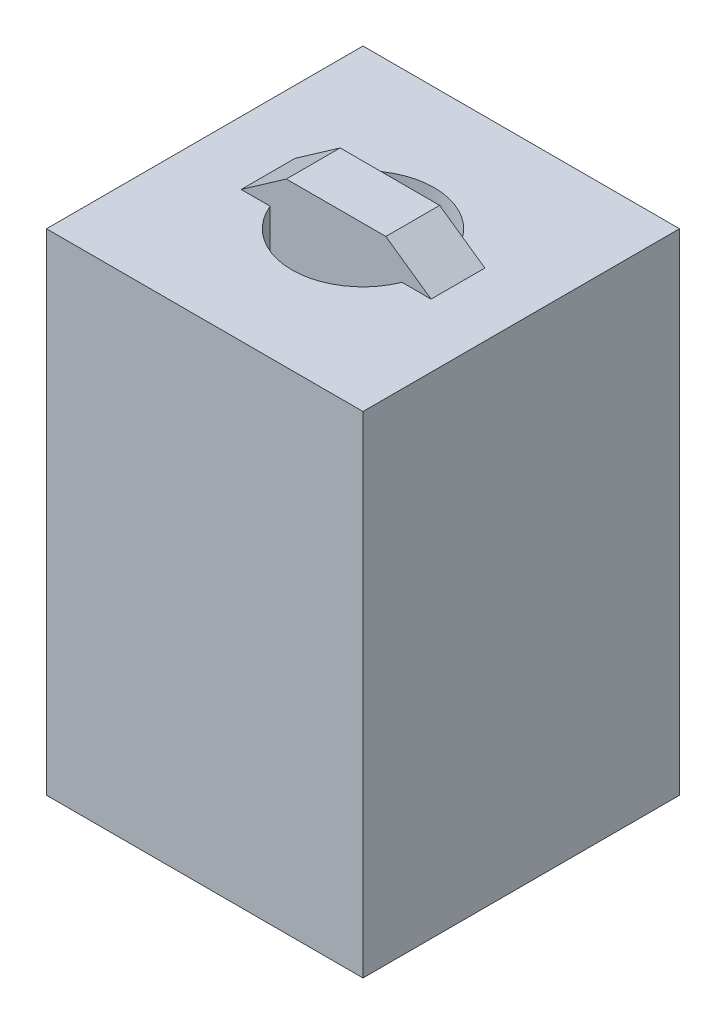
ISO-10303-21;
HEADER;
FILE_DESCRIPTION(('STEP AP214'),'2;1');
FILE_NAME('part.step','',(''),(''),'','','');
FILE_SCHEMA(('AUTOMOTIVE_DESIGN { 1 0 10303 214 1 1 1 1 }'));
ENDSEC;
DATA;
#1=APPLICATION_CONTEXT('core data for automotive mechanical design processes');
#2=APPLICATION_PROTOCOL_DEFINITION('international standard','automotive_design',2000,#1);
#3=PRODUCT_CONTEXT('',#1,'mechanical');
#4=PRODUCT('Part','Part','',(#3));
#5=PRODUCT_RELATED_PRODUCT_CATEGORY('part','',(#4));
#6=PRODUCT_DEFINITION_FORMATION('','',#4);
#7=PRODUCT_DEFINITION_CONTEXT('part definition',#1,'design');
#8=PRODUCT_DEFINITION('design','',#6,#7);
#9=PRODUCT_DEFINITION_SHAPE('','',#8);
#10=(LENGTH_UNIT() NAMED_UNIT(*) SI_UNIT(.MILLI.,.METRE.));
#11=(NAMED_UNIT(*) PLANE_ANGLE_UNIT() SI_UNIT($,.RADIAN.));
#12=(NAMED_UNIT(*) SI_UNIT($,.STERADIAN.) SOLID_ANGLE_UNIT());
#13=UNCERTAINTY_MEASURE_WITH_UNIT(LENGTH_MEASURE(1.E-05),#10,'distance_accuracy_value','');
#14=(GEOMETRIC_REPRESENTATION_CONTEXT(3) GLOBAL_UNCERTAINTY_ASSIGNED_CONTEXT((#13)) GLOBAL_UNIT_ASSIGNED_CONTEXT((#10,
#11,#12)) REPRESENTATION_CONTEXT('',''));
#15=CARTESIAN_POINT('',(0.,0.,0.));
#16=DIRECTION('',(0.,0.,1.));
#17=DIRECTION('',(1.,0.,0.));
#18=AXIS2_PLACEMENT_3D('',#15,#16,#17);
#19=CARTESIAN_POINT('',(0.,39.37,0.));
#20=DIRECTION('',(0.,1.,0.));
#21=DIRECTION('',(0.,0.,1.));
#22=AXIS2_PLACEMENT_3D('',#19,#20,#21);
#23=PLANE('',#22);
#24=DIRECTION('',(0.,0.,-1.));
#25=VECTOR('',#24,1.);
#26=CARTESIAN_POINT('',(12.7,39.37,0.));
#27=LINE('',#26,#25);
#28=CARTESIAN_POINT('',(12.7,39.37,12.7));
#29=VERTEX_POINT('',#28);
#30=CARTESIAN_POINT('',(12.7,39.37,-12.7));
#31=VERTEX_POINT('',#30);
#32=EDGE_CURVE('E178',#29,#31,#27,.T.);
#33=ORIENTED_EDGE('',*,*,#32,.T.);
#34=DIRECTION('',(1.,0.,0.));
#35=VECTOR('',#34,1.);
#36=CARTESIAN_POINT('',(0.,39.37,-12.7));
#37=LINE('',#36,#35);
#38=CARTESIAN_POINT('',(-12.7,39.37,-12.7));
#39=VERTEX_POINT('',#38);
#40=EDGE_CURVE('E181',#39,#31,#37,.T.);
#41=ORIENTED_EDGE('',*,*,#40,.F.);
#42=DIRECTION('',(0.,0.,1.));
#43=VECTOR('',#42,1.);
#44=CARTESIAN_POINT('',(-12.7,39.37,0.));
#45=LINE('',#44,#43);
#46=CARTESIAN_POINT('',(-12.7,39.37,12.7));
#47=VERTEX_POINT('',#46);
#48=EDGE_CURVE('E217',#39,#47,#45,.T.);
#49=ORIENTED_EDGE('',*,*,#48,.T.);
#50=DIRECTION('',(1.,0.,0.));
#51=VECTOR('',#50,1.);
#52=CARTESIAN_POINT('',(0.,39.37,12.7));
#53=LINE('',#52,#51);
#54=EDGE_CURVE('E182',#47,#29,#53,.T.);
#55=ORIENTED_EDGE('',*,*,#54,.T.);
#56=EDGE_LOOP('',(#33,#41,#49,#55));
#57=FACE_BOUND('',#56,.T.);
#58=DIRECTION('',(0.,0.,-1.));
#59=VECTOR('',#58,1.);
#60=CARTESIAN_POINT('',(7.62,39.37,17.6092168269575));
#61=LINE('',#60,#59);
#62=CARTESIAN_POINT('',(7.62,39.37,2.159));
#63=VERTEX_POINT('',#62);
#64=CARTESIAN_POINT('',(7.62,39.37,-2.159));
#65=VERTEX_POINT('',#64);
#66=EDGE_CURVE('E106',#63,#65,#61,.T.);
#67=ORIENTED_EDGE('',*,*,#66,.F.);
#68=DIRECTION('',(-1.,0.,0.));
#69=VECTOR('',#68,1.);
#70=CARTESIAN_POINT('',(-7.62,39.37,2.159));
#71=LINE('',#70,#69);
#72=CARTESIAN_POINT('',(5.29149733062391,39.37,2.159));
#73=VERTEX_POINT('',#72);
#74=EDGE_CURVE('E99',#63,#73,#71,.T.);
#75=ORIENTED_EDGE('',*,*,#74,.T.);
#76=CARTESIAN_POINT('',(0.,39.37,0.));
#77=DIRECTION('',(0.,1.,0.));
#78=DIRECTION('',(0.,0.,1.));
#79=AXIS2_PLACEMENT_3D('',#76,#77,#78);
#80=CIRCLE('',#79,5.715);
#81=CARTESIAN_POINT('',(-5.29149733062391,39.37,2.159));
#82=VERTEX_POINT('',#81);
#83=EDGE_CURVE('E292',#82,#73,#80,.T.);
#84=ORIENTED_EDGE('',*,*,#83,.F.);
#85=CARTESIAN_POINT('',(-7.62,39.37,2.159));
#86=VERTEX_POINT('',#85);
#87=EDGE_CURVE('E12',#82,#86,#71,.T.);
#88=ORIENTED_EDGE('',*,*,#87,.T.);
#89=DIRECTION('',(0.,0.,-1.));
#90=VECTOR('',#89,1.);
#91=CARTESIAN_POINT('',(-7.62,39.37,17.6092168269575));
#92=LINE('',#91,#90);
#93=CARTESIAN_POINT('',(-7.62,39.37,-2.159));
#94=VERTEX_POINT('',#93);
#95=EDGE_CURVE('E245',#86,#94,#92,.T.);
#96=ORIENTED_EDGE('',*,*,#95,.T.);
#97=DIRECTION('',(-1.,0.,0.));
#98=VECTOR('',#97,1.);
#99=CARTESIAN_POINT('',(-7.62,39.37,-2.159));
#100=LINE('',#99,#98);
#101=CARTESIAN_POINT('',(-5.29149733062391,39.37,-2.159));
#102=VERTEX_POINT('',#101);
#103=EDGE_CURVE('E97',#102,#94,#100,.T.);
#104=ORIENTED_EDGE('',*,*,#103,.F.);
#105=CARTESIAN_POINT('',(5.29149733062391,39.37,-2.159));
#106=VERTEX_POINT('',#105);
#107=EDGE_CURVE('E296',#106,#102,#80,.T.);
#108=ORIENTED_EDGE('',*,*,#107,.F.);
#109=EDGE_CURVE('E111',#65,#106,#100,.T.);
#110=ORIENTED_EDGE('',*,*,#109,.F.);
#111=EDGE_LOOP('',(#67,#75,#84,#88,#96,#104,#108,#110));
#112=FACE_BOUND('',#111,.T.);
#113=ADVANCED_FACE('F87',(#57,#112),#23,.T.);
#114=CARTESIAN_POINT('',(0.,0.,0.));
#115=DIRECTION('',(0.,1.,0.));
#116=DIRECTION('',(0.,0.,1.));
#117=AXIS2_PLACEMENT_3D('',#114,#115,#116);
#118=CYLINDRICAL_SURFACE('',#117,5.715);
#119=ORIENTED_EDGE('',*,*,#107,.T.);
#120=DIRECTION('',(0.,1.,0.));
#121=VECTOR('',#120,1.);
#122=CARTESIAN_POINT('',(-5.29149733062391,0.,-2.159));
#123=LINE('',#122,#121);
#124=CARTESIAN_POINT('',(-5.29149733062391,33.02,-2.159));
#125=VERTEX_POINT('',#124);
#126=EDGE_CURVE('E288',#102,#125,#123,.F.);
#127=ORIENTED_EDGE('',*,*,#126,.T.);
#128=CARTESIAN_POINT('',(0.,33.02,0.));
#129=DIRECTION('',(0.,-1.,0.));
#130=DIRECTION('',(0.,0.,-1.));
#131=AXIS2_PLACEMENT_3D('',#128,#129,#130);
#132=CIRCLE('',#131,5.715);
#133=CARTESIAN_POINT('',(-5.29149733062391,33.02,2.159));
#134=VERTEX_POINT('',#133);
#135=EDGE_CURVE('E311',#125,#134,#132,.F.);
#136=ORIENTED_EDGE('',*,*,#135,.T.);
#137=DIRECTION('',(0.,1.,0.));
#138=VECTOR('',#137,1.);
#139=CARTESIAN_POINT('',(-5.29149733062391,0.,2.159));
#140=LINE('',#139,#138);
#141=EDGE_CURVE('E276',#134,#82,#140,.T.);
#142=ORIENTED_EDGE('',*,*,#141,.T.);
#143=ORIENTED_EDGE('',*,*,#83,.T.);
#144=DIRECTION('',(0.,1.,0.));
#145=VECTOR('',#144,1.);
#146=CARTESIAN_POINT('',(5.29149733062391,0.,2.159));
#147=LINE('',#146,#145);
#148=CARTESIAN_POINT('',(5.29149733062391,33.02,2.159));
#149=VERTEX_POINT('',#148);
#150=EDGE_CURVE('E280',#73,#149,#147,.F.);
#151=ORIENTED_EDGE('',*,*,#150,.T.);
#152=CARTESIAN_POINT('',(5.29149733062391,33.02,-2.159));
#153=VERTEX_POINT('',#152);
#154=EDGE_CURVE('E91',#149,#153,#132,.F.);
#155=ORIENTED_EDGE('',*,*,#154,.T.);
#156=DIRECTION('',(0.,1.,0.));
#157=VECTOR('',#156,1.);
#158=CARTESIAN_POINT('',(5.29149733062391,0.,-2.159));
#159=LINE('',#158,#157);
#160=EDGE_CURVE('E284',#153,#106,#159,.T.);
#161=ORIENTED_EDGE('',*,*,#160,.T.);
#162=EDGE_LOOP('',(#119,#127,#136,#142,#143,#151,#155,#161));
#163=FACE_BOUND('',#162,.T.);
#164=CARTESIAN_POINT('',(0.,12.7,0.));
#165=DIRECTION('',(0.,-1.,0.));
#166=DIRECTION('',(0.,0.,-1.));
#167=AXIS2_PLACEMENT_3D('',#164,#165,#166);
#168=CIRCLE('',#167,5.715);
#169=CARTESIAN_POINT('',(0.,12.7,-5.715));
#170=VERTEX_POINT('',#169);
#171=EDGE_CURVE('E301',#170,#170,#168,.F.);
#172=ORIENTED_EDGE('',*,*,#171,.F.);
#173=EDGE_LOOP('',(#172));
#174=FACE_BOUND('',#173,.T.);
#175=ADVANCED_FACE('F341',(#163,#174),#118,.F.);
#176=CARTESIAN_POINT('',(0.,0.,0.));
#177=DIRECTION('',(0.,1.,0.));
#178=DIRECTION('',(0.,0.,1.));
#179=AXIS2_PLACEMENT_3D('',#176,#177,#178);
#180=PLANE('',#179);
#181=CARTESIAN_POINT('',(0.,0.,0.));
#182=DIRECTION('',(0.,-1.,0.));
#183=DIRECTION('',(0.,0.,-1.));
#184=AXIS2_PLACEMENT_3D('',#181,#182,#183);
#185=CIRCLE('',#184,9.3345);
#186=CARTESIAN_POINT('',(0.,0.,-9.3345));
#187=VERTEX_POINT('',#186);
#188=EDGE_CURVE('E302',#187,#187,#185,.T.);
#189=ORIENTED_EDGE('',*,*,#188,.F.);
#190=EDGE_LOOP('',(#189));
#191=FACE_BOUND('',#190,.T.);
#192=DIRECTION('',(-1.,0.,0.));
#193=VECTOR('',#192,1.);
#194=CARTESIAN_POINT('',(0.,0.,-12.7));
#195=LINE('',#194,#193);
#196=CARTESIAN_POINT('',(12.7,0.,-12.7));
#197=VERTEX_POINT('',#196);
#198=CARTESIAN_POINT('',(-12.7,0.,-12.7));
#199=VERTEX_POINT('',#198);
#200=EDGE_CURVE('E204',#197,#199,#195,.T.);
#201=ORIENTED_EDGE('',*,*,#200,.F.);
#202=DIRECTION('',(0.,0.,1.));
#203=VECTOR('',#202,1.);
#204=CARTESIAN_POINT('',(12.7,0.,0.));
#205=LINE('',#204,#203);
#206=CARTESIAN_POINT('',(12.7,0.,12.7));
#207=VERTEX_POINT('',#206);
#208=EDGE_CURVE('E201',#197,#207,#205,.T.);
#209=ORIENTED_EDGE('',*,*,#208,.T.);
#210=DIRECTION('',(-1.,0.,0.));
#211=VECTOR('',#210,1.);
#212=CARTESIAN_POINT('',(0.,0.,12.7));
#213=LINE('',#212,#211);
#214=CARTESIAN_POINT('',(-12.7,0.,12.7));
#215=VERTEX_POINT('',#214);
#216=EDGE_CURVE('E222',#207,#215,#213,.T.);
#217=ORIENTED_EDGE('',*,*,#216,.T.);
#218=DIRECTION('',(0.,0.,-1.));
#219=VECTOR('',#218,1.);
#220=CARTESIAN_POINT('',(-12.7,0.,0.));
#221=LINE('',#220,#219);
#222=EDGE_CURVE('E219',#215,#199,#221,.T.);
#223=ORIENTED_EDGE('',*,*,#222,.T.);
#224=EDGE_LOOP('',(#201,#209,#217,#223));
#225=FACE_BOUND('',#224,.T.);
#226=ADVANCED_FACE('F89',(#191,#225),#180,.F.);
#227=CARTESIAN_POINT('',(0.,12.7,0.));
#228=DIRECTION('',(0.,-1.,0.));
#229=DIRECTION('',(0.,0.,-1.));
#230=AXIS2_PLACEMENT_3D('',#227,#228,#229);
#231=PLANE('',#230);
#232=CARTESIAN_POINT('',(0.,12.7,0.));
#233=DIRECTION('',(0.,-1.,0.));
#234=DIRECTION('',(0.,0.,-1.));
#235=AXIS2_PLACEMENT_3D('',#232,#233,#234);
#236=CIRCLE('',#235,9.3345);
#237=CARTESIAN_POINT('',(0.,12.7,-9.3345));
#238=VERTEX_POINT('',#237);
#239=EDGE_CURVE('E297',#238,#238,#236,.T.);
#240=ORIENTED_EDGE('',*,*,#239,.T.);
#241=EDGE_LOOP('',(#240));
#242=FACE_BOUND('',#241,.T.);
#243=ORIENTED_EDGE('',*,*,#171,.T.);
#244=EDGE_LOOP('',(#243));
#245=FACE_BOUND('',#244,.T.);
#246=ADVANCED_FACE('F390',(#242,#245),#231,.T.);
#247=CARTESIAN_POINT('',(0.,12.7,0.));
#248=DIRECTION('',(0.,-1.,0.));
#249=DIRECTION('',(0.,0.,-1.));
#250=AXIS2_PLACEMENT_3D('',#247,#248,#249);
#251=CYLINDRICAL_SURFACE('',#250,9.3345);
#252=ORIENTED_EDGE('',*,*,#239,.F.);
#253=EDGE_LOOP('',(#252));
#254=FACE_BOUND('',#253,.T.);
#255=ORIENTED_EDGE('',*,*,#188,.T.);
#256=EDGE_LOOP('',(#255));
#257=FACE_BOUND('',#256,.T.);
#258=ADVANCED_FACE('F384',(#254,#257),#251,.F.);
#259=CARTESIAN_POINT('',(0.,33.02,0.));
#260=DIRECTION('',(0.,-1.,0.));
#261=DIRECTION('',(0.,0.,-1.));
#262=AXIS2_PLACEMENT_3D('',#259,#260,#261);
#263=PLANE('',#262);
#264=ORIENTED_EDGE('',*,*,#135,.F.);
#265=DIRECTION('',(-1.,0.,0.));
#266=VECTOR('',#265,1.);
#267=CARTESIAN_POINT('',(5.715,33.02,-2.159));
#268=LINE('',#267,#266);
#269=EDGE_CURVE('E272',#153,#125,#268,.T.);
#270=ORIENTED_EDGE('',*,*,#269,.F.);
#271=ORIENTED_EDGE('',*,*,#154,.F.);
#272=DIRECTION('',(1.,0.,0.));
#273=VECTOR('',#272,1.);
#274=CARTESIAN_POINT('',(5.715,33.02,2.159));
#275=LINE('',#274,#273);
#276=EDGE_CURVE('E268',#134,#149,#275,.T.);
#277=ORIENTED_EDGE('',*,*,#276,.F.);
#278=EDGE_LOOP('',(#264,#270,#271,#277));
#279=FACE_BOUND('',#278,.T.);
#280=ADVANCED_FACE('F346',(#279),#263,.T.);
#281=CARTESIAN_POINT('',(5.715,33.02,-2.159));
#282=DIRECTION('',(0.,0.,-1.));
#283=DIRECTION('',(-1.,0.,0.));
#284=AXIS2_PLACEMENT_3D('',#281,#282,#283);
#285=PLANE('',#284);
#286=ORIENTED_EDGE('',*,*,#126,.F.);
#287=ORIENTED_EDGE('',*,*,#103,.T.);
#288=DIRECTION('',(0.819152044288995,0.573576436351041,0.));
#289=VECTOR('',#288,1.);
#290=CARTESIAN_POINT('',(-3.99250406287499,41.91,-2.159));
#291=LINE('',#290,#289);
#292=CARTESIAN_POINT('',(-3.99250406287499,41.91,-2.159));
#293=VERTEX_POINT('',#292);
#294=EDGE_CURVE('E235',#94,#293,#291,.T.);
#295=ORIENTED_EDGE('',*,*,#294,.T.);
#296=DIRECTION('',(1.,0.,0.));
#297=VECTOR('',#296,1.);
#298=CARTESIAN_POINT('',(3.99250406287499,41.91,-2.159));
#299=LINE('',#298,#297);
#300=CARTESIAN_POINT('',(3.99250406287499,41.91,-2.159));
#301=VERTEX_POINT('',#300);
#302=EDGE_CURVE('E231',#293,#301,#299,.T.);
#303=ORIENTED_EDGE('',*,*,#302,.T.);
#304=DIRECTION('',(0.819152044288995,-0.573576436351042,0.));
#305=VECTOR('',#304,1.);
#306=CARTESIAN_POINT('',(7.62,39.37,-2.159));
#307=LINE('',#306,#305);
#308=EDGE_CURVE('E230',#301,#65,#307,.T.);
#309=ORIENTED_EDGE('',*,*,#308,.T.);
#310=ORIENTED_EDGE('',*,*,#109,.T.);
#311=ORIENTED_EDGE('',*,*,#160,.F.);
#312=ORIENTED_EDGE('',*,*,#269,.T.);
#313=EDGE_LOOP('',(#286,#287,#295,#303,#309,#310,#311,#312));
#314=FACE_BOUND('',#313,.T.);
#315=ADVANCED_FACE('F324',(#314),#285,.T.);
#316=CARTESIAN_POINT('',(5.715,33.02,2.159));
#317=DIRECTION('',(0.,0.,1.));
#318=DIRECTION('',(1.,0.,0.));
#319=AXIS2_PLACEMENT_3D('',#316,#317,#318);
#320=PLANE('',#319);
#321=ORIENTED_EDGE('',*,*,#150,.F.);
#322=ORIENTED_EDGE('',*,*,#74,.F.);
#323=DIRECTION('',(0.819152044288995,-0.573576436351042,0.));
#324=VECTOR('',#323,1.);
#325=CARTESIAN_POINT('',(7.62,39.37,2.159));
#326=LINE('',#325,#324);
#327=CARTESIAN_POINT('',(3.99250406287499,41.91,2.159));
#328=VERTEX_POINT('',#327);
#329=EDGE_CURVE('E246',#328,#63,#326,.T.);
#330=ORIENTED_EDGE('',*,*,#329,.F.);
#331=DIRECTION('',(1.,0.,0.));
#332=VECTOR('',#331,1.);
#333=CARTESIAN_POINT('',(3.99250406287499,41.91,2.159));
#334=LINE('',#333,#332);
#335=CARTESIAN_POINT('',(-3.99250406287499,41.91,2.159));
#336=VERTEX_POINT('',#335);
#337=EDGE_CURVE('E251',#336,#328,#334,.T.);
#338=ORIENTED_EDGE('',*,*,#337,.F.);
#339=DIRECTION('',(0.819152044288995,0.573576436351042,0.));
#340=VECTOR('',#339,1.);
#341=CARTESIAN_POINT('',(-3.99250406287499,41.91,2.159));
#342=LINE('',#341,#340);
#343=EDGE_CURVE('E256',#86,#336,#342,.T.);
#344=ORIENTED_EDGE('',*,*,#343,.F.);
#345=ORIENTED_EDGE('',*,*,#87,.F.);
#346=ORIENTED_EDGE('',*,*,#141,.F.);
#347=ORIENTED_EDGE('',*,*,#276,.T.);
#348=EDGE_LOOP('',(#321,#322,#330,#338,#344,#345,#346,#347));
#349=FACE_BOUND('',#348,.T.);
#350=ADVANCED_FACE('F340',(#349),#320,.T.);
#351=CARTESIAN_POINT('',(-3.99250406287499,41.91,17.6092168269575));
#352=DIRECTION('',(-0.573576436351041,0.819152044288995,0.));
#353=DIRECTION('',(-0.819152044288995,-0.573576436351042,0.));
#354=AXIS2_PLACEMENT_3D('',#351,#352,#353);
#355=PLANE('',#354);
#356=ORIENTED_EDGE('',*,*,#95,.F.);
#357=ORIENTED_EDGE('',*,*,#343,.T.);
#358=DIRECTION('',(0.,0.,-1.));
#359=VECTOR('',#358,1.);
#360=CARTESIAN_POINT('',(-3.99250406287499,41.91,17.6092168269575));
#361=LINE('',#360,#359);
#362=EDGE_CURVE('E255',#336,#293,#361,.T.);
#363=ORIENTED_EDGE('',*,*,#362,.T.);
#364=ORIENTED_EDGE('',*,*,#294,.F.);
#365=EDGE_LOOP('',(#356,#357,#363,#364));
#366=FACE_BOUND('',#365,.T.);
#367=ADVANCED_FACE('F329',(#366),#355,.T.);
#368=CARTESIAN_POINT('',(3.99250406287499,41.91,17.6092168269575));
#369=DIRECTION('',(0.,1.,0.));
#370=DIRECTION('',(0.,0.,1.));
#371=AXIS2_PLACEMENT_3D('',#368,#369,#370);
#372=PLANE('',#371);
#373=ORIENTED_EDGE('',*,*,#362,.F.);
#374=ORIENTED_EDGE('',*,*,#337,.T.);
#375=DIRECTION('',(0.,0.,-1.));
#376=VECTOR('',#375,1.);
#377=CARTESIAN_POINT('',(3.99250406287499,41.91,17.6092168269575));
#378=LINE('',#377,#376);
#379=EDGE_CURVE('E250',#328,#301,#378,.T.);
#380=ORIENTED_EDGE('',*,*,#379,.T.);
#381=ORIENTED_EDGE('',*,*,#302,.F.);
#382=EDGE_LOOP('',(#373,#374,#380,#381));
#383=FACE_BOUND('',#382,.T.);
#384=ADVANCED_FACE('F333',(#383),#372,.T.);
#385=CARTESIAN_POINT('',(7.62,39.37,17.6092168269575));
#386=DIRECTION('',(0.573576436351042,0.819152044288995,0.));
#387=DIRECTION('',(-0.819152044288995,0.573576436351042,0.));
#388=AXIS2_PLACEMENT_3D('',#385,#386,#387);
#389=PLANE('',#388);
#390=ORIENTED_EDGE('',*,*,#379,.F.);
#391=ORIENTED_EDGE('',*,*,#329,.T.);
#392=ORIENTED_EDGE('',*,*,#66,.T.);
#393=ORIENTED_EDGE('',*,*,#308,.F.);
#394=EDGE_LOOP('',(#390,#391,#392,#393));
#395=FACE_BOUND('',#394,.T.);
#396=ADVANCED_FACE('F337',(#395),#389,.T.);
#397=CARTESIAN_POINT('',(0.,-17.9605122421383,12.7));
#398=DIRECTION('',(0.,0.,1.));
#399=DIRECTION('',(1.,0.,0.));
#400=AXIS2_PLACEMENT_3D('',#397,#398,#399);
#401=PLANE('',#400);
#402=ORIENTED_EDGE('',*,*,#216,.F.);
#403=DIRECTION('',(0.,1.,0.));
#404=VECTOR('',#403,1.);
#405=CARTESIAN_POINT('',(12.7,-17.9605122421383,12.7));
#406=LINE('',#405,#404);
#407=EDGE_CURVE('E187',#207,#29,#406,.T.);
#408=ORIENTED_EDGE('',*,*,#407,.T.);
#409=ORIENTED_EDGE('',*,*,#54,.F.);
#410=DIRECTION('',(0.,1.,0.));
#411=VECTOR('',#410,1.);
#412=CARTESIAN_POINT('',(-12.7,-17.9605122421383,12.7));
#413=LINE('',#412,#411);
#414=EDGE_CURVE('E198',#215,#47,#413,.T.);
#415=ORIENTED_EDGE('',*,*,#414,.F.);
#416=EDGE_LOOP('',(#402,#408,#409,#415));
#417=FACE_BOUND('',#416,.T.);
#418=ADVANCED_FACE('F415',(#417),#401,.T.);
#419=CARTESIAN_POINT('',(12.7,-17.9605122421383,0.));
#420=DIRECTION('',(1.,0.,0.));
#421=DIRECTION('',(0.,0.,-1.));
#422=AXIS2_PLACEMENT_3D('',#419,#420,#421);
#423=PLANE('',#422);
#424=ORIENTED_EDGE('',*,*,#208,.F.);
#425=DIRECTION('',(0.,1.,0.));
#426=VECTOR('',#425,1.);
#427=CARTESIAN_POINT('',(12.7,-17.9605122421383,-12.7));
#428=LINE('',#427,#426);
#429=EDGE_CURVE('E194',#197,#31,#428,.T.);
#430=ORIENTED_EDGE('',*,*,#429,.T.);
#431=ORIENTED_EDGE('',*,*,#32,.F.);
#432=ORIENTED_EDGE('',*,*,#407,.F.);
#433=EDGE_LOOP('',(#424,#430,#431,#432));
#434=FACE_BOUND('',#433,.T.);
#435=ADVANCED_FACE('F200',(#434),#423,.T.);
#436=CARTESIAN_POINT('',(-12.7,-17.9605122421383,0.));
#437=DIRECTION('',(-1.,0.,0.));
#438=DIRECTION('',(0.,0.,1.));
#439=AXIS2_PLACEMENT_3D('',#436,#437,#438);
#440=PLANE('',#439);
#441=ORIENTED_EDGE('',*,*,#222,.F.);
#442=ORIENTED_EDGE('',*,*,#414,.T.);
#443=ORIENTED_EDGE('',*,*,#48,.F.);
#444=DIRECTION('',(0.,1.,0.));
#445=VECTOR('',#444,1.);
#446=CARTESIAN_POINT('',(-12.7,-17.9605122421383,-12.7));
#447=LINE('',#446,#445);
#448=EDGE_CURVE('E196',#199,#39,#447,.T.);
#449=ORIENTED_EDGE('',*,*,#448,.F.);
#450=EDGE_LOOP('',(#441,#442,#443,#449));
#451=FACE_BOUND('',#450,.T.);
#452=ADVANCED_FACE('F412',(#451),#440,.T.);
#453=CARTESIAN_POINT('',(0.,-17.9605122421383,-12.7));
#454=DIRECTION('',(0.,0.,1.));
#455=DIRECTION('',(1.,0.,0.));
#456=AXIS2_PLACEMENT_3D('',#453,#454,#455);
#457=PLANE('',#456);
#458=ORIENTED_EDGE('',*,*,#40,.T.);
#459=ORIENTED_EDGE('',*,*,#429,.F.);
#460=ORIENTED_EDGE('',*,*,#200,.T.);
#461=ORIENTED_EDGE('',*,*,#448,.T.);
#462=EDGE_LOOP('',(#458,#459,#460,#461));
#463=FACE_BOUND('',#462,.T.);
#464=ADVANCED_FACE('F192',(#463),#457,.F.);
#465=CLOSED_SHELL('',(#113,#175,#226,#246,#258,#280,#315,#350,#367,#384,#396,#418,#435,#452,#464));
#466=MANIFOLD_SOLID_BREP('B2',#465);
#467=ADVANCED_BREP_SHAPE_REPRESENTATION('',(#18,#466),#14);
#468=SHAPE_DEFINITION_REPRESENTATION(#9,#467);
ENDSEC;
END-ISO-10303-21;
